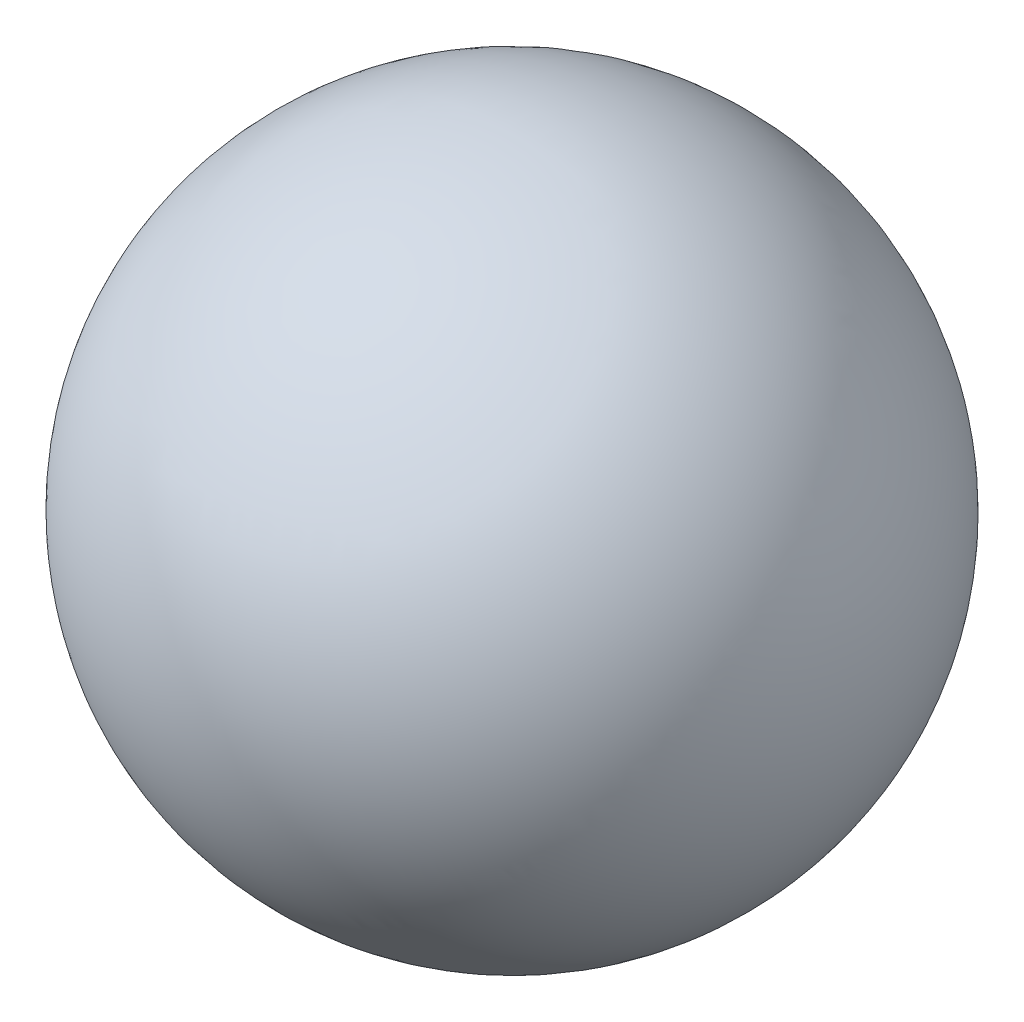
ISO-10303-21;
HEADER;
FILE_DESCRIPTION(('STEP AP214'),'2;1');
FILE_NAME('part.step','',(''),(''),'','','');
FILE_SCHEMA(('AUTOMOTIVE_DESIGN { 1 0 10303 214 1 1 1 1 }'));
ENDSEC;
DATA;
#1=APPLICATION_CONTEXT('core data for automotive mechanical design processes');
#2=APPLICATION_PROTOCOL_DEFINITION('international standard','automotive_design',2000,#1);
#3=PRODUCT_CONTEXT('',#1,'mechanical');
#4=PRODUCT('Part','Part','',(#3));
#5=PRODUCT_RELATED_PRODUCT_CATEGORY('part','',(#4));
#6=PRODUCT_DEFINITION_FORMATION('','',#4);
#7=PRODUCT_DEFINITION_CONTEXT('part definition',#1,'design');
#8=PRODUCT_DEFINITION('design','',#6,#7);
#9=PRODUCT_DEFINITION_SHAPE('','',#8);
#10=(LENGTH_UNIT() NAMED_UNIT(*) SI_UNIT(.MILLI.,.METRE.));
#11=(NAMED_UNIT(*) PLANE_ANGLE_UNIT() SI_UNIT($,.RADIAN.));
#12=(NAMED_UNIT(*) SI_UNIT($,.STERADIAN.) SOLID_ANGLE_UNIT());
#13=UNCERTAINTY_MEASURE_WITH_UNIT(LENGTH_MEASURE(1.E-05),#10,'distance_accuracy_value','');
#14=(GEOMETRIC_REPRESENTATION_CONTEXT(3) GLOBAL_UNCERTAINTY_ASSIGNED_CONTEXT((#13)) GLOBAL_UNIT_ASSIGNED_CONTEXT((#10,
#11,#12)) REPRESENTATION_CONTEXT('',''));
#15=CARTESIAN_POINT('',(0.,0.,0.));
#16=DIRECTION('',(0.,0.,1.));
#17=DIRECTION('',(1.,0.,0.));
#18=AXIS2_PLACEMENT_3D('',#15,#16,#17);
#19=CARTESIAN_POINT('',(-192.189874687889,-18.1367369452692,0.));
#20=DIRECTION('',(0.,0.,-1.));
#21=DIRECTION('',(0.200149509669548,-0.979765366697068,0.));
#22=AXIS2_PLACEMENT_3D('',#19,#20,#21);
#23=CIRCLE('',#22,5.01304213649389);
#24=TRIMMED_CURVE('',#23,(PARAMETER_VALUE(-1.5591613930296)),(PARAMETER_VALUE(1.5591613930296)),
.T.,.PARAMETER.);
#25=CARTESIAN_POINT('',(-192.178200948268,-18.1938818555858,0.));
#26=DIRECTION('',(-0.979765366697068,-0.200149509669548,0.));
#27=AXIS1_PLACEMENT('',#25,#26);
#28=SURFACE_OF_REVOLUTION('',#24,#27);
#29=CARTESIAN_POINT('',(-197.089473573024,-19.197171868798,0.));
#30=VERTEX_POINT('',#29);
#31=VERTEX_LOOP('',#30);
#32=FACE_BOUND('',#31,.T.);
#33=CARTESIAN_POINT('',(-187.266928323512,-17.1905918423735,0.));
#34=VERTEX_POINT('',#33);
#35=VERTEX_LOOP('',#34);
#36=FACE_BOUND('',#35,.T.);
#37=ADVANCED_FACE('F31',(#32,#36),#28,.T.);
#38=CLOSED_SHELL('',(#37));
#39=MANIFOLD_SOLID_BREP('B2',#38);
#40=ADVANCED_BREP_SHAPE_REPRESENTATION('',(#18,#39),#14);
#41=SHAPE_DEFINITION_REPRESENTATION(#9,#40);
ENDSEC;
END-ISO-10303-21;
